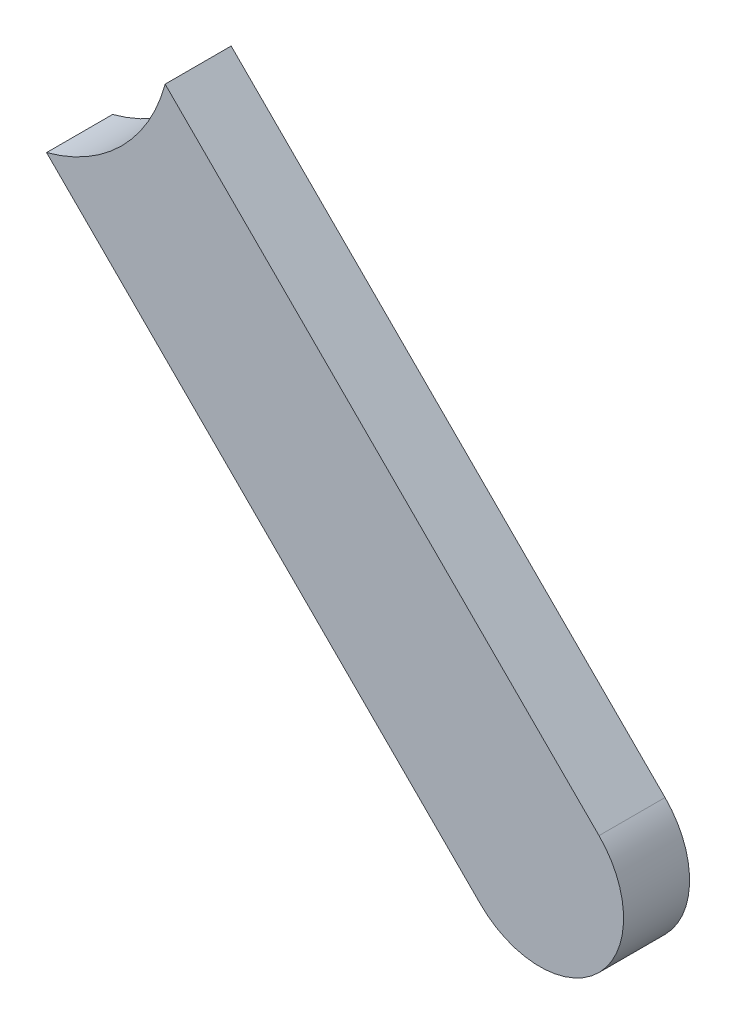
ISO-10303-21;
HEADER;
FILE_DESCRIPTION(('STEP AP214'),'2;1');
FILE_NAME('part.step','',(''),(''),'','','');
FILE_SCHEMA(('AUTOMOTIVE_DESIGN { 1 0 10303 214 1 1 1 1 }'));
ENDSEC;
DATA;
#1=APPLICATION_CONTEXT('core data for automotive mechanical design processes');
#2=APPLICATION_PROTOCOL_DEFINITION('international standard','automotive_design',2000,#1);
#3=PRODUCT_CONTEXT('',#1,'mechanical');
#4=PRODUCT('Part','Part','',(#3));
#5=PRODUCT_RELATED_PRODUCT_CATEGORY('part','',(#4));
#6=PRODUCT_DEFINITION_FORMATION('','',#4);
#7=PRODUCT_DEFINITION_CONTEXT('part definition',#1,'design');
#8=PRODUCT_DEFINITION('design','',#6,#7);
#9=PRODUCT_DEFINITION_SHAPE('','',#8);
#10=(LENGTH_UNIT() NAMED_UNIT(*) SI_UNIT(.MILLI.,.METRE.));
#11=(NAMED_UNIT(*) PLANE_ANGLE_UNIT() SI_UNIT($,.RADIAN.));
#12=(NAMED_UNIT(*) SI_UNIT($,.STERADIAN.) SOLID_ANGLE_UNIT());
#13=UNCERTAINTY_MEASURE_WITH_UNIT(LENGTH_MEASURE(1.E-05),#10,'distance_accuracy_value','');
#14=(GEOMETRIC_REPRESENTATION_CONTEXT(3) GLOBAL_UNCERTAINTY_ASSIGNED_CONTEXT((#13)) GLOBAL_UNIT_ASSIGNED_CONTEXT((#10,
#11,#12)) REPRESENTATION_CONTEXT('',''));
#15=CARTESIAN_POINT('',(0.,0.,0.));
#16=DIRECTION('',(0.,0.,1.));
#17=DIRECTION('',(1.,0.,0.));
#18=AXIS2_PLACEMENT_3D('',#15,#16,#17);
#19=CARTESIAN_POINT('',(90.3014807885386,66.1843098714614,0.));
#20=DIRECTION('',(0.707106781186548,0.707106781186548,0.));
#21=DIRECTION('',(0.707106781186548,-0.707106781186548,0.));
#22=AXIS2_PLACEMENT_3D('',#19,#20,#21);
#23=PLANE('',#22);
#24=DIRECTION('',(0.707106781186548,-0.707106781186548,0.));
#25=VECTOR('',#24,1.);
#26=CARTESIAN_POINT('',(89.9903966,66.49539406,0.1999996));
#27=LINE('',#26,#25);
#28=CARTESIAN_POINT('',(90.3014807885386,66.1843098714614,0.1999996));
#29=VERTEX_POINT('',#28);
#30=CARTESIAN_POINT('',(91.61599406,64.8697966,0.1999996));
#31=VERTEX_POINT('',#30);
#32=EDGE_CURVE('E11',#29,#31,#27,.T.);
#33=ORIENTED_EDGE('',*,*,#32,.F.);
#34=DIRECTION('',(0.,0.,1.));
#35=VECTOR('',#34,1.);
#36=CARTESIAN_POINT('',(90.3014807885386,66.1843098714614,0.));
#37=LINE('',#36,#35);
#38=CARTESIAN_POINT('',(90.3014807885386,66.1843098714614,0.));
#39=VERTEX_POINT('',#38);
#40=EDGE_CURVE('E24',#39,#29,#37,.T.);
#41=ORIENTED_EDGE('',*,*,#40,.F.);
#42=DIRECTION('',(0.707106781186548,-0.707106781186548,0.));
#43=VECTOR('',#42,1.);
#44=CARTESIAN_POINT('',(89.9903966,66.49539406,0.));
#45=LINE('',#44,#43);
#46=CARTESIAN_POINT('',(91.61599406,64.8697966,0.));
#47=VERTEX_POINT('',#46);
#48=EDGE_CURVE('E75',#39,#47,#45,.T.);
#49=ORIENTED_EDGE('',*,*,#48,.T.);
#50=DIRECTION('',(0.,0.,1.));
#51=VECTOR('',#50,1.);
#52=CARTESIAN_POINT('',(91.61599406,64.8697966,0.));
#53=LINE('',#52,#51);
#54=EDGE_CURVE('E37',#47,#31,#53,.T.);
#55=ORIENTED_EDGE('',*,*,#54,.T.);
#56=EDGE_LOOP('',(#33,#41,#49,#55));
#57=FACE_BOUND('',#56,.T.);
#58=ADVANCED_FACE('F17',(#57),#23,.F.);
#59=CARTESIAN_POINT('',(91.79559873,65.04940127,0.));
#60=DIRECTION('',(0.,0.,-1.));
#61=DIRECTION('',(-0.707106781186548,-0.707106781186548,0.));
#62=AXIS2_PLACEMENT_3D('',#59,#60,#61);
#63=CYLINDRICAL_SURFACE('',#62,0.253999360179549);
#64=CARTESIAN_POINT('',(91.79559873,65.04940127,0.1999996));
#65=DIRECTION('',(0.,0.,1.));
#66=DIRECTION('',(-0.707106781186548,-0.707106781186548,0.));
#67=AXIS2_PLACEMENT_3D('',#64,#65,#66);
#68=CIRCLE('',#67,0.253999360179549);
#69=CARTESIAN_POINT('',(91.9752034,65.22900594,0.1999996));
#70=VERTEX_POINT('',#69);
#71=EDGE_CURVE('E83',#31,#70,#68,.T.);
#72=ORIENTED_EDGE('',*,*,#71,.F.);
#73=ORIENTED_EDGE('',*,*,#54,.F.);
#74=CARTESIAN_POINT('',(91.79559873,65.04940127,0.));
#75=DIRECTION('',(0.,0.,1.));
#76=DIRECTION('',(-0.707106781186548,-0.707106781186548,0.));
#77=AXIS2_PLACEMENT_3D('',#74,#75,#76);
#78=CIRCLE('',#77,0.253999360179549);
#79=CARTESIAN_POINT('',(91.9752034,65.22900594,0.));
#80=VERTEX_POINT('',#79);
#81=EDGE_CURVE('E81',#47,#80,#78,.T.);
#82=ORIENTED_EDGE('',*,*,#81,.T.);
#83=DIRECTION('',(0.,0.,1.));
#84=VECTOR('',#83,1.);
#85=CARTESIAN_POINT('',(91.9752034,65.22900594,0.));
#86=LINE('',#85,#84);
#87=EDGE_CURVE('E67',#80,#70,#86,.T.);
#88=ORIENTED_EDGE('',*,*,#87,.T.);
#89=EDGE_LOOP('',(#72,#73,#82,#88));
#90=FACE_BOUND('',#89,.T.);
#91=ADVANCED_FACE('F89',(#90),#63,.T.);
#92=CARTESIAN_POINT('',(91.9752034,65.22900594,0.));
#93=DIRECTION('',(-0.707106781186544,-0.707106781186551,0.));
#94=DIRECTION('',(-0.707106781186551,0.707106781186544,0.));
#95=AXIS2_PLACEMENT_3D('',#92,#93,#94);
#96=PLANE('',#95);
#97=DIRECTION('',(-0.707106781186551,0.707106781186544,0.));
#98=VECTOR('',#97,1.);
#99=CARTESIAN_POINT('',(91.9752034,65.22900594,0.1999996));
#100=LINE('',#99,#98);
#101=CARTESIAN_POINT('',(90.6606901285386,66.5435192114614,0.1999996));
#102=VERTEX_POINT('',#101);
#103=EDGE_CURVE('E71',#70,#102,#100,.T.);
#104=ORIENTED_EDGE('',*,*,#103,.F.);
#105=ORIENTED_EDGE('',*,*,#87,.F.);
#106=DIRECTION('',(-0.707106781186551,0.707106781186544,0.));
#107=VECTOR('',#106,1.);
#108=CARTESIAN_POINT('',(91.9752034,65.22900594,0.));
#109=LINE('',#108,#107);
#110=CARTESIAN_POINT('',(90.6606901285386,66.5435192114614,0.));
#111=VERTEX_POINT('',#110);
#112=EDGE_CURVE('E63',#80,#111,#109,.T.);
#113=ORIENTED_EDGE('',*,*,#112,.T.);
#114=DIRECTION('',(0.,0.,1.));
#115=VECTOR('',#114,1.);
#116=CARTESIAN_POINT('',(90.6606901285386,66.5435192114614,0.));
#117=LINE('',#116,#115);
#118=EDGE_CURVE('E53',#111,#102,#117,.T.);
#119=ORIENTED_EDGE('',*,*,#118,.T.);
#120=EDGE_LOOP('',(#104,#105,#113,#119));
#121=FACE_BOUND('',#120,.T.);
#122=ADVANCED_FACE('F66',(#121),#96,.F.);
#123=CARTESIAN_POINT('',(90.17,66.675,0.));
#124=DIRECTION('',(0.,0.,-1.));
#125=DIRECTION('',(1.,0.,0.));
#126=AXIS2_PLACEMENT_3D('',#123,#124,#125);
#127=CYLINDRICAL_SURFACE('',#126,0.508);
#128=ORIENTED_EDGE('',*,*,#40,.T.);
#129=CARTESIAN_POINT('',(90.17,66.675,0.1999996));
#130=DIRECTION('',(0.,0.,1.));
#131=DIRECTION('',(1.,0.,0.));
#132=AXIS2_PLACEMENT_3D('',#129,#130,#131);
#133=CIRCLE('',#132,0.508);
#134=EDGE_CURVE('E59',#29,#102,#133,.T.);
#135=ORIENTED_EDGE('',*,*,#134,.T.);
#136=ORIENTED_EDGE('',*,*,#118,.F.);
#137=CARTESIAN_POINT('',(90.17,66.675,0.));
#138=DIRECTION('',(0.,0.,1.));
#139=DIRECTION('',(1.,0.,0.));
#140=AXIS2_PLACEMENT_3D('',#137,#138,#139);
#141=CIRCLE('',#140,0.508);
#142=EDGE_CURVE('E57',#39,#111,#141,.T.);
#143=ORIENTED_EDGE('',*,*,#142,.F.);
#144=EDGE_LOOP('',(#128,#135,#136,#143));
#145=FACE_BOUND('',#144,.T.);
#146=ADVANCED_FACE('F55',(#145),#127,.F.);
#147=CARTESIAN_POINT('',(89.9903966,66.49539406,0.));
#148=DIRECTION('',(0.,0.,-1.));
#149=DIRECTION('',(-1.,0.,0.));
#150=AXIS2_PLACEMENT_3D('',#147,#148,#149);
#151=PLANE('',#150);
#152=ORIENTED_EDGE('',*,*,#48,.F.);
#153=ORIENTED_EDGE('',*,*,#142,.T.);
#154=ORIENTED_EDGE('',*,*,#112,.F.);
#155=ORIENTED_EDGE('',*,*,#81,.F.);
#156=EDGE_LOOP('',(#152,#153,#154,#155));
#157=FACE_BOUND('',#156,.T.);
#158=ADVANCED_FACE('F74',(#157),#151,.T.);
#159=CARTESIAN_POINT('',(89.9903966,66.49539406,0.1999996));
#160=DIRECTION('',(0.,0.,-1.));
#161=DIRECTION('',(-1.,0.,0.));
#162=AXIS2_PLACEMENT_3D('',#159,#160,#161);
#163=PLANE('',#162);
#164=ORIENTED_EDGE('',*,*,#134,.F.);
#165=ORIENTED_EDGE('',*,*,#32,.T.);
#166=ORIENTED_EDGE('',*,*,#71,.T.);
#167=ORIENTED_EDGE('',*,*,#103,.T.);
#168=EDGE_LOOP('',(#164,#165,#166,#167));
#169=FACE_BOUND('',#168,.T.);
#170=ADVANCED_FACE('F91',(#169),#163,.F.);
#171=CLOSED_SHELL('',(#58,#91,#122,#146,#158,#170));
#172=MANIFOLD_SOLID_BREP('B1',#171);
#173=ADVANCED_BREP_SHAPE_REPRESENTATION('',(#18,#172),#14);
#174=SHAPE_DEFINITION_REPRESENTATION(#9,#173);
ENDSEC;
END-ISO-10303-21;
